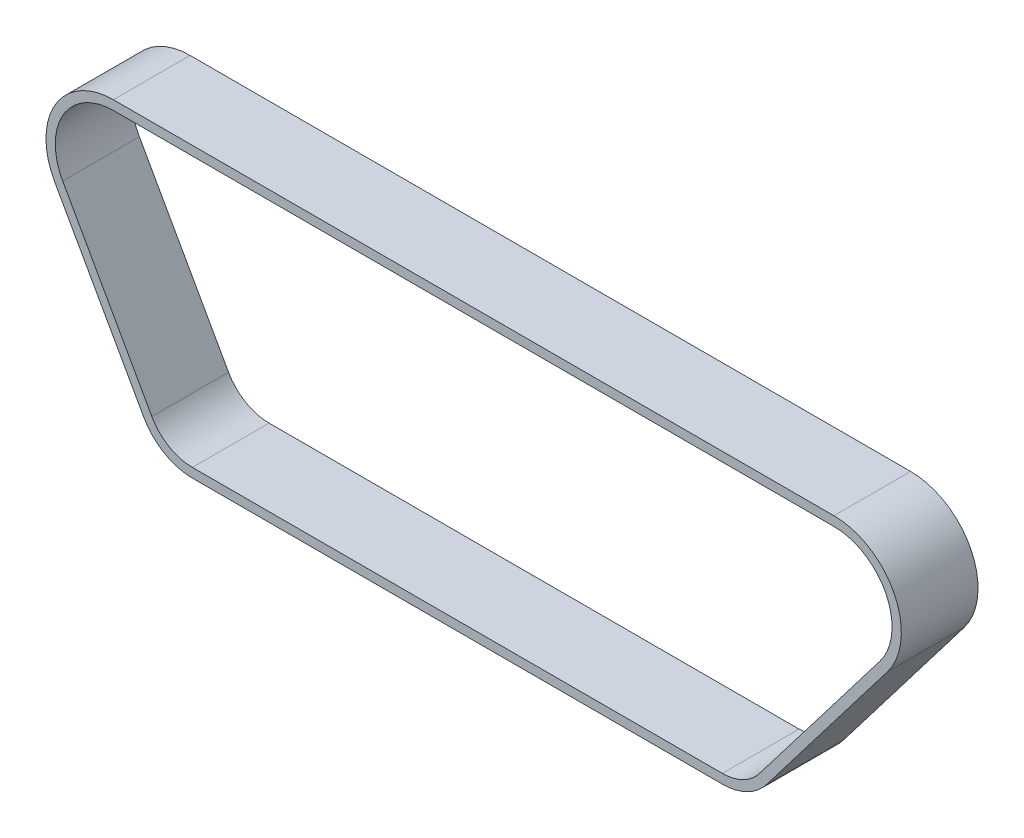
ISO-10303-21;
HEADER;
FILE_DESCRIPTION(('STEP AP214'),'2;1');
FILE_NAME('part.step','',(''),(''),'','','');
FILE_SCHEMA(('AUTOMOTIVE_DESIGN { 1 0 10303 214 1 1 1 1 }'));
ENDSEC;
DATA;
#1=APPLICATION_CONTEXT('core data for automotive mechanical design processes');
#2=APPLICATION_PROTOCOL_DEFINITION('international standard','automotive_design',2000,#1);
#3=PRODUCT_CONTEXT('',#1,'mechanical');
#4=PRODUCT('Part','Part','',(#3));
#5=PRODUCT_RELATED_PRODUCT_CATEGORY('part','',(#4));
#6=PRODUCT_DEFINITION_FORMATION('','',#4);
#7=PRODUCT_DEFINITION_CONTEXT('part definition',#1,'design');
#8=PRODUCT_DEFINITION('design','',#6,#7);
#9=PRODUCT_DEFINITION_SHAPE('','',#8);
#10=(LENGTH_UNIT() NAMED_UNIT(*) SI_UNIT(.MILLI.,.METRE.));
#11=(NAMED_UNIT(*) PLANE_ANGLE_UNIT() SI_UNIT($,.RADIAN.));
#12=(NAMED_UNIT(*) SI_UNIT($,.STERADIAN.) SOLID_ANGLE_UNIT());
#13=UNCERTAINTY_MEASURE_WITH_UNIT(LENGTH_MEASURE(1.E-05),#10,'distance_accuracy_value','');
#14=(GEOMETRIC_REPRESENTATION_CONTEXT(3) GLOBAL_UNCERTAINTY_ASSIGNED_CONTEXT((#13)) GLOBAL_UNIT_ASSIGNED_CONTEXT((#10,
#11,#12)) REPRESENTATION_CONTEXT('',''));
#15=CARTESIAN_POINT('',(0.,0.,0.));
#16=DIRECTION('',(0.,0.,1.));
#17=DIRECTION('',(1.,0.,0.));
#18=AXIS2_PLACEMENT_3D('',#15,#16,#17);
#19=CARTESIAN_POINT('',(-138.,-35.5,8.25));
#20=DIRECTION('',(0.,0.,1.));
#21=DIRECTION('',(1.,0.,0.));
#22=AXIS2_PLACEMENT_3D('',#19,#20,#21);
#23=PLANE('',#22);
#24=CARTESIAN_POINT('',(-138.,-35.5,8.25));
#25=DIRECTION('',(0.,0.,1.));
#26=DIRECTION('',(1.,0.,0.));
#27=AXIS2_PLACEMENT_3D('',#24,#25,#26);
#28=CIRCLE('',#27,12.);
#29=CARTESIAN_POINT('',(-148.471984817734,-41.3598237155347,8.25));
#30=VERTEX_POINT('',#29);
#31=CARTESIAN_POINT('',(-138.,-47.5,8.25));
#32=VERTEX_POINT('',#31);
#33=EDGE_CURVE('E243',#30,#32,#28,.T.);
#34=ORIENTED_EDGE('',*,*,#33,.T.);
#35=DIRECTION('',(1.,0.,0.));
#36=VECTOR('',#35,1.);
#37=CARTESIAN_POINT('',(-138.,-47.5,8.25));
#38=LINE('',#37,#36);
#39=CARTESIAN_POINT('',(-24.,-47.5,8.25));
#40=VERTEX_POINT('',#39);
#41=EDGE_CURVE('E246',#32,#40,#38,.T.);
#42=ORIENTED_EDGE('',*,*,#41,.T.);
#43=CARTESIAN_POINT('',(-24.,-35.5,8.25));
#44=DIRECTION('',(0.,0.,1.));
#45=DIRECTION('',(1.,0.,0.));
#46=AXIS2_PLACEMENT_3D('',#43,#44,#45);
#47=CIRCLE('',#46,12.);
#48=CARTESIAN_POINT('',(-14.4677246071892,-42.7894256176749,8.25));
#49=VERTEX_POINT('',#48);
#50=EDGE_CURVE('E251',#40,#49,#47,.T.);
#51=ORIENTED_EDGE('',*,*,#50,.T.);
#52=DIRECTION('',(0.607452134806239,0.794356282734229,0.));
#53=VECTOR('',#52,1.);
#54=CARTESIAN_POINT('',(11.5181660996463,-8.80805595469047,8.25));
#55=LINE('',#54,#53);
#56=CARTESIAN_POINT('',(11.5181660996463,-8.80805595469047,8.25));
#57=VERTEX_POINT('',#56);
#58=EDGE_CURVE('E254',#49,#57,#55,.T.);
#59=ORIENTED_EDGE('',*,*,#58,.T.);
#60=CARTESIAN_POINT('',(0.,0.,8.25));
#61=DIRECTION('',(0.,0.,1.));
#62=DIRECTION('',(1.,0.,0.));
#63=AXIS2_PLACEMENT_3D('',#60,#61,#62);
#64=CIRCLE('',#63,14.5);
#65=CARTESIAN_POINT('',(0.,14.5,8.25));
#66=VERTEX_POINT('',#65);
#67=EDGE_CURVE('E260',#57,#66,#64,.T.);
#68=ORIENTED_EDGE('',*,*,#67,.T.);
#69=DIRECTION('',(-1.,0.,0.));
#70=VECTOR('',#69,1.);
#71=CARTESIAN_POINT('',(-155.,14.5,8.25));
#72=LINE('',#71,#70);
#73=CARTESIAN_POINT('',(-155.,14.5,8.25));
#74=VERTEX_POINT('',#73);
#75=EDGE_CURVE('E259',#66,#74,#72,.T.);
#76=ORIENTED_EDGE('',*,*,#75,.T.);
#77=CARTESIAN_POINT('',(-155.,0.,8.25));
#78=DIRECTION('',(0.,0.,1.));
#79=DIRECTION('',(1.,0.,0.));
#80=AXIS2_PLACEMENT_3D('',#77,#78,#79);
#81=CIRCLE('',#80,14.5);
#82=CARTESIAN_POINT('',(-167.653648321429,-7.08062032293776,8.25));
#83=VERTEX_POINT('',#82);
#84=EDGE_CURVE('E265',#74,#83,#81,.T.);
#85=ORIENTED_EDGE('',*,*,#84,.T.);
#86=DIRECTION('',(0.488318642961226,-0.872665401477855,0.));
#87=VECTOR('',#86,1.);
#88=CARTESIAN_POINT('',(-167.653648321429,-7.08062032293777,8.25));
#89=LINE('',#88,#87);
#90=EDGE_CURVE('E264',#83,#30,#89,.T.);
#91=ORIENTED_EDGE('',*,*,#90,.T.);
#92=EDGE_LOOP('',(#34,#42,#51,#59,#68,#76,#85,#91));
#93=FACE_BOUND('',#92,.T.);
#94=DIRECTION('',(0.488318642961226,-0.872665401477855,0.));
#95=VECTOR('',#94,1.);
#96=CARTESIAN_POINT('',(-165.908317518473,-6.10398303701532,8.25));
#97=LINE('',#96,#95);
#98=CARTESIAN_POINT('',(-165.908317518473,-6.10398303701532,8.25));
#99=VERTEX_POINT('',#98);
#100=CARTESIAN_POINT('',(-146.726654014779,-40.3831864296123,8.25));
#101=VERTEX_POINT('',#100);
#102=EDGE_CURVE('E171',#99,#101,#97,.T.);
#103=ORIENTED_EDGE('',*,*,#102,.F.);
#104=CARTESIAN_POINT('',(-155.,0.,8.25));
#105=DIRECTION('',(0.,0.,1.));
#106=DIRECTION('',(1.,0.,0.));
#107=AXIS2_PLACEMENT_3D('',#104,#105,#106);
#108=CIRCLE('',#107,12.5);
#109=CARTESIAN_POINT('',(-155.,12.5,8.25));
#110=VERTEX_POINT('',#109);
#111=EDGE_CURVE('E164',#110,#99,#108,.T.);
#112=ORIENTED_EDGE('',*,*,#111,.F.);
#113=DIRECTION('',(-1.,0.,0.));
#114=VECTOR('',#113,1.);
#115=CARTESIAN_POINT('',(-155.,12.5,8.25));
#116=LINE('',#115,#114);
#117=CARTESIAN_POINT('',(0.,12.5,8.25));
#118=VERTEX_POINT('',#117);
#119=EDGE_CURVE('E202',#118,#110,#116,.T.);
#120=ORIENTED_EDGE('',*,*,#119,.F.);
#121=CARTESIAN_POINT('',(0.,0.,8.25));
#122=DIRECTION('',(0.,0.,1.));
#123=DIRECTION('',(1.,0.,0.));
#124=AXIS2_PLACEMENT_3D('',#121,#122,#123);
#125=CIRCLE('',#124,12.5);
#126=CARTESIAN_POINT('',(9.92945353417786,-7.59315168507799,8.25));
#127=VERTEX_POINT('',#126);
#128=EDGE_CURVE('E201',#127,#118,#125,.T.);
#129=ORIENTED_EDGE('',*,*,#128,.F.);
#130=DIRECTION('',(0.607452134806239,0.794356282734229,0.));
#131=VECTOR('',#130,1.);
#132=CARTESIAN_POINT('',(9.92945353417786,-7.59315168507799,8.25));
#133=LINE('',#132,#131);
#134=CARTESIAN_POINT('',(-16.0564371726577,-41.5745213480624,8.25));
#135=VERTEX_POINT('',#134);
#136=EDGE_CURVE('E203',#135,#127,#133,.T.);
#137=ORIENTED_EDGE('',*,*,#136,.F.);
#138=CARTESIAN_POINT('',(-24.,-35.5,8.25));
#139=DIRECTION('',(0.,0.,1.));
#140=DIRECTION('',(1.,0.,0.));
#141=AXIS2_PLACEMENT_3D('',#138,#139,#140);
#142=CIRCLE('',#141,9.99999999999999);
#143=CARTESIAN_POINT('',(-24.,-45.5,8.25));
#144=VERTEX_POINT('',#143);
#145=EDGE_CURVE('E200',#144,#135,#142,.T.);
#146=ORIENTED_EDGE('',*,*,#145,.F.);
#147=DIRECTION('',(1.,0.,0.));
#148=VECTOR('',#147,1.);
#149=CARTESIAN_POINT('',(-138.,-45.5,8.25));
#150=LINE('',#149,#148);
#151=CARTESIAN_POINT('',(-138.,-45.5,8.25));
#152=VERTEX_POINT('',#151);
#153=EDGE_CURVE('E191',#152,#144,#150,.T.);
#154=ORIENTED_EDGE('',*,*,#153,.F.);
#155=CARTESIAN_POINT('',(-138.,-35.5,8.25));
#156=DIRECTION('',(0.,0.,1.));
#157=DIRECTION('',(1.,0.,0.));
#158=AXIS2_PLACEMENT_3D('',#155,#156,#157);
#159=CIRCLE('',#158,10.);
#160=EDGE_CURVE('E189',#101,#152,#159,.T.);
#161=ORIENTED_EDGE('',*,*,#160,.F.);
#162=EDGE_LOOP('',(#103,#112,#120,#129,#137,#146,#154,#161));
#163=FACE_BOUND('',#162,.T.);
#164=ADVANCED_FACE('F44',(#93,#163),#23,.T.);
#165=CARTESIAN_POINT('',(-138.,-35.5,-8.25));
#166=DIRECTION('',(0.,0.,1.));
#167=DIRECTION('',(1.,0.,0.));
#168=AXIS2_PLACEMENT_3D('',#165,#166,#167);
#169=PLANE('',#168);
#170=CARTESIAN_POINT('',(-138.,-35.5,-8.25));
#171=DIRECTION('',(0.,0.,1.));
#172=DIRECTION('',(1.,0.,0.));
#173=AXIS2_PLACEMENT_3D('',#170,#171,#172);
#174=CIRCLE('',#173,12.);
#175=CARTESIAN_POINT('',(-148.471984817734,-41.3598237155347,-8.25));
#176=VERTEX_POINT('',#175);
#177=CARTESIAN_POINT('',(-138.,-47.5,-8.25));
#178=VERTEX_POINT('',#177);
#179=EDGE_CURVE('E181',#176,#178,#174,.T.);
#180=ORIENTED_EDGE('',*,*,#179,.F.);
#181=DIRECTION('',(0.488318642961226,-0.872665401477855,0.));
#182=VECTOR('',#181,1.);
#183=CARTESIAN_POINT('',(-167.653648321429,-7.08062032293777,-8.25));
#184=LINE('',#183,#182);
#185=CARTESIAN_POINT('',(-167.653648321429,-7.08062032293776,-8.25));
#186=VERTEX_POINT('',#185);
#187=EDGE_CURVE('E248',#186,#176,#184,.T.);
#188=ORIENTED_EDGE('',*,*,#187,.F.);
#189=CARTESIAN_POINT('',(-155.,0.,-8.25));
#190=DIRECTION('',(0.,0.,1.));
#191=DIRECTION('',(1.,0.,0.));
#192=AXIS2_PLACEMENT_3D('',#189,#190,#191);
#193=CIRCLE('',#192,14.5);
#194=CARTESIAN_POINT('',(-155.,14.5,-8.25));
#195=VERTEX_POINT('',#194);
#196=EDGE_CURVE('E284',#195,#186,#193,.T.);
#197=ORIENTED_EDGE('',*,*,#196,.F.);
#198=DIRECTION('',(-1.,0.,0.));
#199=VECTOR('',#198,1.);
#200=CARTESIAN_POINT('',(-155.,14.5,-8.25));
#201=LINE('',#200,#199);
#202=CARTESIAN_POINT('',(0.,14.5,-8.25));
#203=VERTEX_POINT('',#202);
#204=EDGE_CURVE('E278',#203,#195,#201,.T.);
#205=ORIENTED_EDGE('',*,*,#204,.F.);
#206=CARTESIAN_POINT('',(0.,0.,-8.25));
#207=DIRECTION('',(0.,0.,1.));
#208=DIRECTION('',(1.,0.,0.));
#209=AXIS2_PLACEMENT_3D('',#206,#207,#208);
#210=CIRCLE('',#209,14.5);
#211=CARTESIAN_POINT('',(11.5181660996463,-8.80805595469047,-8.25));
#212=VERTEX_POINT('',#211);
#213=EDGE_CURVE('E279',#212,#203,#210,.T.);
#214=ORIENTED_EDGE('',*,*,#213,.F.);
#215=DIRECTION('',(0.607452134806239,0.794356282734229,0.));
#216=VECTOR('',#215,1.);
#217=CARTESIAN_POINT('',(11.5181660996463,-8.80805595469047,-8.25));
#218=LINE('',#217,#216);
#219=CARTESIAN_POINT('',(-14.4677246071892,-42.7894256176749,-8.25));
#220=VERTEX_POINT('',#219);
#221=EDGE_CURVE('E277',#220,#212,#218,.T.);
#222=ORIENTED_EDGE('',*,*,#221,.F.);
#223=CARTESIAN_POINT('',(-24.,-35.5,-8.25));
#224=DIRECTION('',(0.,0.,1.));
#225=DIRECTION('',(1.,0.,0.));
#226=AXIS2_PLACEMENT_3D('',#223,#224,#225);
#227=CIRCLE('',#226,12.);
#228=CARTESIAN_POINT('',(-24.,-47.5,-8.25));
#229=VERTEX_POINT('',#228);
#230=EDGE_CURVE('E273',#229,#220,#227,.T.);
#231=ORIENTED_EDGE('',*,*,#230,.F.);
#232=DIRECTION('',(1.,0.,0.));
#233=VECTOR('',#232,1.);
#234=CARTESIAN_POINT('',(-138.,-47.5,-8.25));
#235=LINE('',#234,#233);
#236=EDGE_CURVE('E271',#178,#229,#235,.T.);
#237=ORIENTED_EDGE('',*,*,#236,.F.);
#238=EDGE_LOOP('',(#180,#188,#197,#205,#214,#222,#231,#237));
#239=FACE_BOUND('',#238,.T.);
#240=CARTESIAN_POINT('',(-155.,0.,-8.25));
#241=DIRECTION('',(0.,0.,1.));
#242=DIRECTION('',(1.,0.,0.));
#243=AXIS2_PLACEMENT_3D('',#240,#241,#242);
#244=CIRCLE('',#243,12.5);
#245=CARTESIAN_POINT('',(-155.,12.5,-8.25));
#246=VERTEX_POINT('',#245);
#247=CARTESIAN_POINT('',(-165.908317518473,-6.10398303701532,-8.25));
#248=VERTEX_POINT('',#247);
#249=EDGE_CURVE('E66',#246,#248,#244,.T.);
#250=ORIENTED_EDGE('',*,*,#249,.T.);
#251=DIRECTION('',(0.488318642961226,-0.872665401477855,0.));
#252=VECTOR('',#251,1.);
#253=CARTESIAN_POINT('',(-165.908317518473,-6.10398303701532,-8.25));
#254=LINE('',#253,#252);
#255=CARTESIAN_POINT('',(-146.726654014779,-40.3831864296123,-8.25));
#256=VERTEX_POINT('',#255);
#257=EDGE_CURVE('E182',#248,#256,#254,.T.);
#258=ORIENTED_EDGE('',*,*,#257,.T.);
#259=CARTESIAN_POINT('',(-138.,-35.5,-8.25));
#260=DIRECTION('',(0.,0.,1.));
#261=DIRECTION('',(1.,0.,0.));
#262=AXIS2_PLACEMENT_3D('',#259,#260,#261);
#263=CIRCLE('',#262,10.);
#264=CARTESIAN_POINT('',(-138.,-45.5,-8.25));
#265=VERTEX_POINT('',#264);
#266=EDGE_CURVE('E215',#256,#265,#263,.T.);
#267=ORIENTED_EDGE('',*,*,#266,.T.);
#268=DIRECTION('',(1.,0.,0.));
#269=VECTOR('',#268,1.);
#270=CARTESIAN_POINT('',(-138.,-45.5,-8.25));
#271=LINE('',#270,#269);
#272=CARTESIAN_POINT('',(-24.,-45.5,-8.25));
#273=VERTEX_POINT('',#272);
#274=EDGE_CURVE('E216',#265,#273,#271,.T.);
#275=ORIENTED_EDGE('',*,*,#274,.T.);
#276=CARTESIAN_POINT('',(-24.,-35.5,-8.25));
#277=DIRECTION('',(0.,0.,1.));
#278=DIRECTION('',(1.,0.,0.));
#279=AXIS2_PLACEMENT_3D('',#276,#277,#278);
#280=CIRCLE('',#279,9.99999999999999);
#281=CARTESIAN_POINT('',(-16.0564371726577,-41.5745213480624,-8.25));
#282=VERTEX_POINT('',#281);
#283=EDGE_CURVE('E219',#273,#282,#280,.T.);
#284=ORIENTED_EDGE('',*,*,#283,.T.);
#285=DIRECTION('',(0.607452134806239,0.794356282734229,0.));
#286=VECTOR('',#285,1.);
#287=CARTESIAN_POINT('',(9.92945353417786,-7.59315168507799,-8.25));
#288=LINE('',#287,#286);
#289=CARTESIAN_POINT('',(9.92945353417786,-7.59315168507799,-8.25));
#290=VERTEX_POINT('',#289);
#291=EDGE_CURVE('E224',#282,#290,#288,.T.);
#292=ORIENTED_EDGE('',*,*,#291,.T.);
#293=CARTESIAN_POINT('',(0.,0.,-8.25));
#294=DIRECTION('',(0.,0.,1.));
#295=DIRECTION('',(1.,0.,0.));
#296=AXIS2_PLACEMENT_3D('',#293,#294,#295);
#297=CIRCLE('',#296,12.5);
#298=CARTESIAN_POINT('',(0.,12.5,-8.25));
#299=VERTEX_POINT('',#298);
#300=EDGE_CURVE('E227',#290,#299,#297,.T.);
#301=ORIENTED_EDGE('',*,*,#300,.T.);
#302=DIRECTION('',(-1.,0.,0.));
#303=VECTOR('',#302,1.);
#304=CARTESIAN_POINT('',(-155.,12.5,-8.25));
#305=LINE('',#304,#303);
#306=EDGE_CURVE('E173',#299,#246,#305,.T.);
#307=ORIENTED_EDGE('',*,*,#306,.T.);
#308=EDGE_LOOP('',(#250,#258,#267,#275,#284,#292,#301,#307));
#309=FACE_BOUND('',#308,.T.);
#310=ADVANCED_FACE('F312',(#239,#309),#169,.F.);
#311=CARTESIAN_POINT('',(-138.,-35.5,8.25));
#312=DIRECTION('',(0.,0.,-1.));
#313=DIRECTION('',(-1.,0.,0.));
#314=AXIS2_PLACEMENT_3D('',#311,#312,#313);
#315=CYLINDRICAL_SURFACE('',#314,12.);
#316=ORIENTED_EDGE('',*,*,#179,.T.);
#317=DIRECTION('',(0.,0.,-1.));
#318=VECTOR('',#317,1.);
#319=CARTESIAN_POINT('',(-138.,-47.5,8.25));
#320=LINE('',#319,#318);
#321=EDGE_CURVE('E11',#32,#178,#320,.T.);
#322=ORIENTED_EDGE('',*,*,#321,.F.);
#323=ORIENTED_EDGE('',*,*,#33,.F.);
#324=DIRECTION('',(0.,0.,-1.));
#325=VECTOR('',#324,1.);
#326=CARTESIAN_POINT('',(-148.471984817734,-41.3598237155347,8.25));
#327=LINE('',#326,#325);
#328=EDGE_CURVE('E270',#30,#176,#327,.T.);
#329=ORIENTED_EDGE('',*,*,#328,.T.);
#330=EDGE_LOOP('',(#316,#322,#323,#329));
#331=FACE_BOUND('',#330,.T.);
#332=ADVANCED_FACE('F50',(#331),#315,.T.);
#333=CARTESIAN_POINT('',(-138.,-47.5,8.25));
#334=DIRECTION('',(0.,1.,0.));
#335=DIRECTION('',(0.,0.,1.));
#336=AXIS2_PLACEMENT_3D('',#333,#334,#335);
#337=PLANE('',#336);
#338=ORIENTED_EDGE('',*,*,#236,.T.);
#339=DIRECTION('',(0.,0.,-1.));
#340=VECTOR('',#339,1.);
#341=CARTESIAN_POINT('',(-24.,-47.5,8.25));
#342=LINE('',#341,#340);
#343=EDGE_CURVE('E53',#40,#229,#342,.T.);
#344=ORIENTED_EDGE('',*,*,#343,.F.);
#345=ORIENTED_EDGE('',*,*,#41,.F.);
#346=ORIENTED_EDGE('',*,*,#321,.T.);
#347=EDGE_LOOP('',(#338,#344,#345,#346));
#348=FACE_BOUND('',#347,.T.);
#349=ADVANCED_FACE('F335',(#348),#337,.F.);
#350=CARTESIAN_POINT('',(-24.,-35.5,8.25));
#351=DIRECTION('',(0.,0.,-1.));
#352=DIRECTION('',(-1.,0.,0.));
#353=AXIS2_PLACEMENT_3D('',#350,#351,#352);
#354=CYLINDRICAL_SURFACE('',#353,12.);
#355=ORIENTED_EDGE('',*,*,#230,.T.);
#356=DIRECTION('',(0.,0.,-1.));
#357=VECTOR('',#356,1.);
#358=CARTESIAN_POINT('',(-14.4677246071892,-42.7894256176749,8.25));
#359=LINE('',#358,#357);
#360=EDGE_CURVE('E304',#49,#220,#359,.T.);
#361=ORIENTED_EDGE('',*,*,#360,.F.);
#362=ORIENTED_EDGE('',*,*,#50,.F.);
#363=ORIENTED_EDGE('',*,*,#343,.T.);
#364=EDGE_LOOP('',(#355,#361,#362,#363));
#365=FACE_BOUND('',#364,.T.);
#366=ADVANCED_FACE('F310',(#365),#354,.T.);
#367=CARTESIAN_POINT('',(11.5181660996463,-8.80805595469047,8.25));
#368=DIRECTION('',(-0.794356282734229,0.607452134806239,0.));
#369=DIRECTION('',(-0.607452134806239,-0.794356282734229,0.));
#370=AXIS2_PLACEMENT_3D('',#367,#368,#369);
#371=PLANE('',#370);
#372=ORIENTED_EDGE('',*,*,#221,.T.);
#373=DIRECTION('',(0.,0.,-1.));
#374=VECTOR('',#373,1.);
#375=CARTESIAN_POINT('',(11.5181660996463,-8.80805595469047,8.25));
#376=LINE('',#375,#374);
#377=EDGE_CURVE('E296',#57,#212,#376,.T.);
#378=ORIENTED_EDGE('',*,*,#377,.F.);
#379=ORIENTED_EDGE('',*,*,#58,.F.);
#380=ORIENTED_EDGE('',*,*,#360,.T.);
#381=EDGE_LOOP('',(#372,#378,#379,#380));
#382=FACE_BOUND('',#381,.T.);
#383=ADVANCED_FACE('F321',(#382),#371,.F.);
#384=CARTESIAN_POINT('',(0.,0.,8.25));
#385=DIRECTION('',(0.,0.,-1.));
#386=DIRECTION('',(-1.,0.,0.));
#387=AXIS2_PLACEMENT_3D('',#384,#385,#386);
#388=CYLINDRICAL_SURFACE('',#387,14.5);
#389=ORIENTED_EDGE('',*,*,#213,.T.);
#390=DIRECTION('',(0.,0.,-1.));
#391=VECTOR('',#390,1.);
#392=CARTESIAN_POINT('',(0.,14.5,8.25));
#393=LINE('',#392,#391);
#394=EDGE_CURVE('E297',#66,#203,#393,.T.);
#395=ORIENTED_EDGE('',*,*,#394,.F.);
#396=ORIENTED_EDGE('',*,*,#67,.F.);
#397=ORIENTED_EDGE('',*,*,#377,.T.);
#398=EDGE_LOOP('',(#389,#395,#396,#397));
#399=FACE_BOUND('',#398,.T.);
#400=ADVANCED_FACE('F324',(#399),#388,.T.);
#401=CARTESIAN_POINT('',(-155.,14.5,8.25));
#402=DIRECTION('',(0.,-1.,0.));
#403=DIRECTION('',(1.,0.,0.));
#404=AXIS2_PLACEMENT_3D('',#401,#402,#403);
#405=PLANE('',#404);
#406=ORIENTED_EDGE('',*,*,#204,.T.);
#407=DIRECTION('',(0.,0.,-1.));
#408=VECTOR('',#407,1.);
#409=CARTESIAN_POINT('',(-155.,14.5,8.25));
#410=LINE('',#409,#408);
#411=EDGE_CURVE('E291',#74,#195,#410,.T.);
#412=ORIENTED_EDGE('',*,*,#411,.F.);
#413=ORIENTED_EDGE('',*,*,#75,.F.);
#414=ORIENTED_EDGE('',*,*,#394,.T.);
#415=EDGE_LOOP('',(#406,#412,#413,#414));
#416=FACE_BOUND('',#415,.T.);
#417=ADVANCED_FACE('F343',(#416),#405,.F.);
#418=CARTESIAN_POINT('',(-155.,0.,8.25));
#419=DIRECTION('',(0.,0.,-1.));
#420=DIRECTION('',(-1.,0.,0.));
#421=AXIS2_PLACEMENT_3D('',#418,#419,#420);
#422=CYLINDRICAL_SURFACE('',#421,14.5);
#423=ORIENTED_EDGE('',*,*,#196,.T.);
#424=DIRECTION('',(0.,0.,-1.));
#425=VECTOR('',#424,1.);
#426=CARTESIAN_POINT('',(-167.653648321429,-7.08062032293776,8.25));
#427=LINE('',#426,#425);
#428=EDGE_CURVE('E286',#83,#186,#427,.T.);
#429=ORIENTED_EDGE('',*,*,#428,.F.);
#430=ORIENTED_EDGE('',*,*,#84,.F.);
#431=ORIENTED_EDGE('',*,*,#411,.T.);
#432=EDGE_LOOP('',(#423,#429,#430,#431));
#433=FACE_BOUND('',#432,.T.);
#434=ADVANCED_FACE('F345',(#433),#422,.T.);
#435=CARTESIAN_POINT('',(-167.653648321429,-7.08062032293777,8.25));
#436=DIRECTION('',(0.872665401477855,0.488318642961226,0.));
#437=DIRECTION('',(-0.488318642961226,0.872665401477856,0.));
#438=AXIS2_PLACEMENT_3D('',#435,#436,#437);
#439=PLANE('',#438);
#440=ORIENTED_EDGE('',*,*,#187,.T.);
#441=ORIENTED_EDGE('',*,*,#328,.F.);
#442=ORIENTED_EDGE('',*,*,#90,.F.);
#443=ORIENTED_EDGE('',*,*,#428,.T.);
#444=EDGE_LOOP('',(#440,#441,#442,#443));
#445=FACE_BOUND('',#444,.T.);
#446=ADVANCED_FACE('F339',(#445),#439,.F.);
#447=CARTESIAN_POINT('',(-155.,0.,8.25));
#448=DIRECTION('',(0.,0.,-1.));
#449=DIRECTION('',(-1.,0.,0.));
#450=AXIS2_PLACEMENT_3D('',#447,#448,#449);
#451=CYLINDRICAL_SURFACE('',#450,12.5);
#452=ORIENTED_EDGE('',*,*,#249,.F.);
#453=DIRECTION('',(0.,0.,-1.));
#454=VECTOR('',#453,1.);
#455=CARTESIAN_POINT('',(-155.,12.5,8.25));
#456=LINE('',#455,#454);
#457=EDGE_CURVE('E166',#110,#246,#456,.T.);
#458=ORIENTED_EDGE('',*,*,#457,.F.);
#459=ORIENTED_EDGE('',*,*,#111,.T.);
#460=DIRECTION('',(0.,0.,-1.));
#461=VECTOR('',#460,1.);
#462=CARTESIAN_POINT('',(-165.908317518473,-6.10398303701532,8.25));
#463=LINE('',#462,#461);
#464=EDGE_CURVE('E169',#99,#248,#463,.T.);
#465=ORIENTED_EDGE('',*,*,#464,.T.);
#466=EDGE_LOOP('',(#452,#458,#459,#465));
#467=FACE_BOUND('',#466,.T.);
#468=ADVANCED_FACE('F170',(#467),#451,.F.);
#469=CARTESIAN_POINT('',(-165.908317518473,-6.10398303701532,8.25));
#470=DIRECTION('',(0.872665401477855,0.488318642961226,0.));
#471=DIRECTION('',(-0.488318642961226,0.872665401477856,0.));
#472=AXIS2_PLACEMENT_3D('',#469,#470,#471);
#473=PLANE('',#472);
#474=ORIENTED_EDGE('',*,*,#257,.F.);
#475=ORIENTED_EDGE('',*,*,#464,.F.);
#476=ORIENTED_EDGE('',*,*,#102,.T.);
#477=DIRECTION('',(0.,0.,-1.));
#478=VECTOR('',#477,1.);
#479=CARTESIAN_POINT('',(-146.726654014779,-40.3831864296123,8.25));
#480=LINE('',#479,#478);
#481=EDGE_CURVE('E184',#101,#256,#480,.T.);
#482=ORIENTED_EDGE('',*,*,#481,.T.);
#483=EDGE_LOOP('',(#474,#475,#476,#482));
#484=FACE_BOUND('',#483,.T.);
#485=ADVANCED_FACE('F180',(#484),#473,.T.);
#486=CARTESIAN_POINT('',(-138.,-35.5,8.25));
#487=DIRECTION('',(0.,0.,-1.));
#488=DIRECTION('',(-1.,0.,0.));
#489=AXIS2_PLACEMENT_3D('',#486,#487,#488);
#490=CYLINDRICAL_SURFACE('',#489,10.);
#491=ORIENTED_EDGE('',*,*,#266,.F.);
#492=ORIENTED_EDGE('',*,*,#481,.F.);
#493=ORIENTED_EDGE('',*,*,#160,.T.);
#494=DIRECTION('',(0.,0.,-1.));
#495=VECTOR('',#494,1.);
#496=CARTESIAN_POINT('',(-138.,-45.5,8.25));
#497=LINE('',#496,#495);
#498=EDGE_CURVE('E238',#152,#265,#497,.T.);
#499=ORIENTED_EDGE('',*,*,#498,.T.);
#500=EDGE_LOOP('',(#491,#492,#493,#499));
#501=FACE_BOUND('',#500,.T.);
#502=ADVANCED_FACE('F369',(#501),#490,.F.);
#503=CARTESIAN_POINT('',(-138.,-45.5,8.25));
#504=DIRECTION('',(0.,1.,0.));
#505=DIRECTION('',(-1.,0.,0.));
#506=AXIS2_PLACEMENT_3D('',#503,#504,#505);
#507=PLANE('',#506);
#508=ORIENTED_EDGE('',*,*,#274,.F.);
#509=ORIENTED_EDGE('',*,*,#498,.F.);
#510=ORIENTED_EDGE('',*,*,#153,.T.);
#511=DIRECTION('',(0.,0.,-1.));
#512=VECTOR('',#511,1.);
#513=CARTESIAN_POINT('',(-24.,-45.5,8.25));
#514=LINE('',#513,#512);
#515=EDGE_CURVE('E236',#144,#273,#514,.T.);
#516=ORIENTED_EDGE('',*,*,#515,.T.);
#517=EDGE_LOOP('',(#508,#509,#510,#516));
#518=FACE_BOUND('',#517,.T.);
#519=ADVANCED_FACE('F371',(#518),#507,.T.);
#520=CARTESIAN_POINT('',(-24.,-35.5,8.25));
#521=DIRECTION('',(0.,0.,-1.));
#522=DIRECTION('',(-1.,0.,0.));
#523=AXIS2_PLACEMENT_3D('',#520,#521,#522);
#524=CYLINDRICAL_SURFACE('',#523,9.99999999999999);
#525=ORIENTED_EDGE('',*,*,#283,.F.);
#526=ORIENTED_EDGE('',*,*,#515,.F.);
#527=ORIENTED_EDGE('',*,*,#145,.T.);
#528=DIRECTION('',(0.,0.,-1.));
#529=VECTOR('',#528,1.);
#530=CARTESIAN_POINT('',(-16.0564371726577,-41.5745213480624,8.25));
#531=LINE('',#530,#529);
#532=EDGE_CURVE('E237',#135,#282,#531,.T.);
#533=ORIENTED_EDGE('',*,*,#532,.T.);
#534=EDGE_LOOP('',(#525,#526,#527,#533));
#535=FACE_BOUND('',#534,.T.);
#536=ADVANCED_FACE('F380',(#535),#524,.F.);
#537=CARTESIAN_POINT('',(9.92945353417786,-7.59315168507799,8.25));
#538=DIRECTION('',(-0.794356282734229,0.607452134806239,0.));
#539=DIRECTION('',(-0.607452134806239,-0.794356282734229,0.));
#540=AXIS2_PLACEMENT_3D('',#537,#538,#539);
#541=PLANE('',#540);
#542=ORIENTED_EDGE('',*,*,#291,.F.);
#543=ORIENTED_EDGE('',*,*,#532,.F.);
#544=ORIENTED_EDGE('',*,*,#136,.T.);
#545=DIRECTION('',(0.,0.,-1.));
#546=VECTOR('',#545,1.);
#547=CARTESIAN_POINT('',(9.92945353417786,-7.59315168507799,8.25));
#548=LINE('',#547,#546);
#549=EDGE_CURVE('E231',#127,#290,#548,.T.);
#550=ORIENTED_EDGE('',*,*,#549,.T.);
#551=EDGE_LOOP('',(#542,#543,#544,#550));
#552=FACE_BOUND('',#551,.T.);
#553=ADVANCED_FACE('F381',(#552),#541,.T.);
#554=CARTESIAN_POINT('',(0.,0.,8.25));
#555=DIRECTION('',(0.,0.,-1.));
#556=DIRECTION('',(-1.,0.,0.));
#557=AXIS2_PLACEMENT_3D('',#554,#555,#556);
#558=CYLINDRICAL_SURFACE('',#557,12.5);
#559=ORIENTED_EDGE('',*,*,#300,.F.);
#560=ORIENTED_EDGE('',*,*,#549,.F.);
#561=ORIENTED_EDGE('',*,*,#128,.T.);
#562=DIRECTION('',(0.,0.,-1.));
#563=VECTOR('',#562,1.);
#564=CARTESIAN_POINT('',(0.,12.5,8.25));
#565=LINE('',#564,#563);
#566=EDGE_CURVE('E62',#118,#299,#565,.T.);
#567=ORIENTED_EDGE('',*,*,#566,.T.);
#568=EDGE_LOOP('',(#559,#560,#561,#567));
#569=FACE_BOUND('',#568,.T.);
#570=ADVANCED_FACE('F384',(#569),#558,.F.);
#571=CARTESIAN_POINT('',(-155.,12.5,8.25));
#572=DIRECTION('',(0.,-1.,0.));
#573=DIRECTION('',(1.,0.,0.));
#574=AXIS2_PLACEMENT_3D('',#571,#572,#573);
#575=PLANE('',#574);
#576=ORIENTED_EDGE('',*,*,#306,.F.);
#577=ORIENTED_EDGE('',*,*,#566,.F.);
#578=ORIENTED_EDGE('',*,*,#119,.T.);
#579=ORIENTED_EDGE('',*,*,#457,.T.);
#580=EDGE_LOOP('',(#576,#577,#578,#579));
#581=FACE_BOUND('',#580,.T.);
#582=ADVANCED_FACE('F386',(#581),#575,.T.);
#583=CLOSED_SHELL('',(#164,#310,#332,#349,#366,#383,#400,#417,#434,#446,#468,#485,#502,#519,
#536,#553,#570,#582));
#584=MANIFOLD_SOLID_BREP('B2',#583);
#585=ADVANCED_BREP_SHAPE_REPRESENTATION('',(#18,#584),#14);
#586=SHAPE_DEFINITION_REPRESENTATION(#9,#585);
ENDSEC;
END-ISO-10303-21;
